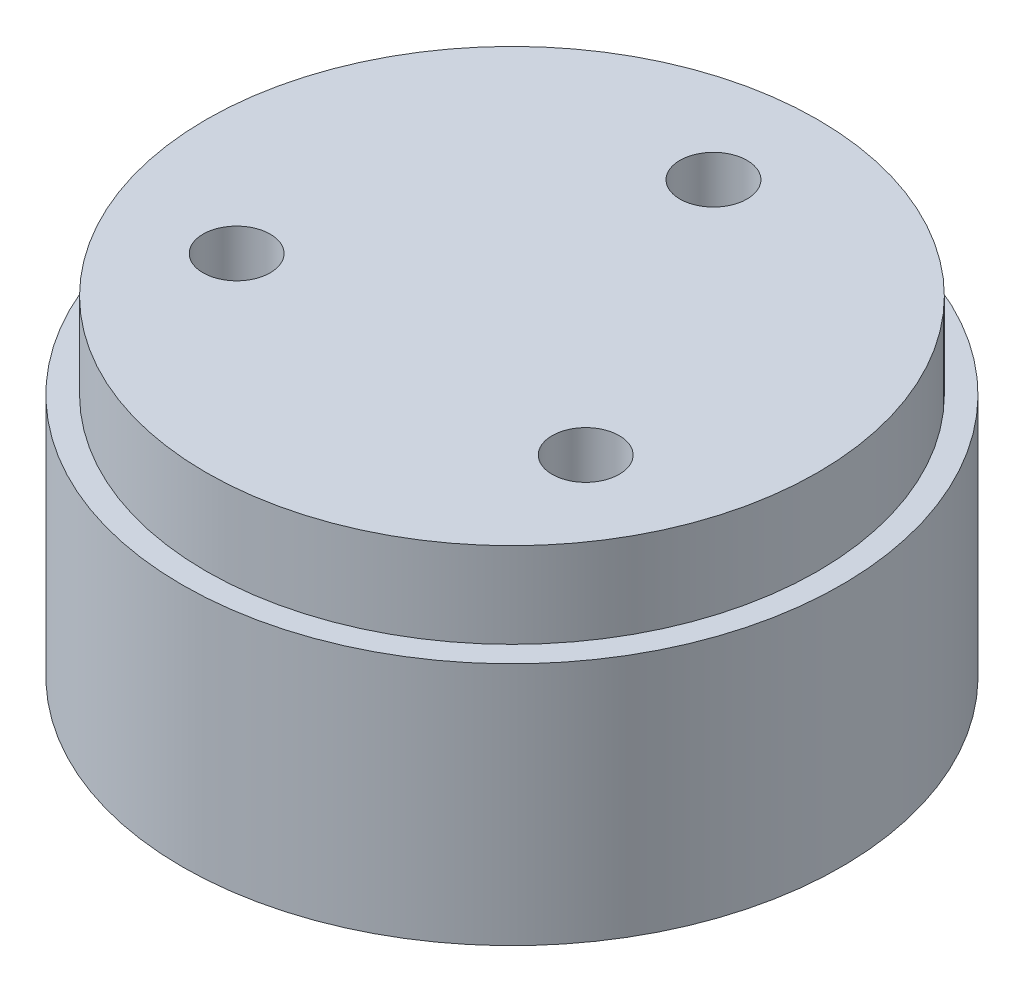
ISO-10303-21;
HEADER;
FILE_DESCRIPTION(('STEP AP214'),'2;1');
FILE_NAME('part.step','',(''),(''),'','','');
FILE_SCHEMA(('AUTOMOTIVE_DESIGN { 1 0 10303 214 1 1 1 1 }'));
ENDSEC;
DATA;
#1=APPLICATION_CONTEXT('core data for automotive mechanical design processes');
#2=APPLICATION_PROTOCOL_DEFINITION('international standard','automotive_design',2000,#1);
#3=PRODUCT_CONTEXT('',#1,'mechanical');
#4=PRODUCT('Part','Part','',(#3));
#5=PRODUCT_RELATED_PRODUCT_CATEGORY('part','',(#4));
#6=PRODUCT_DEFINITION_FORMATION('','',#4);
#7=PRODUCT_DEFINITION_CONTEXT('part definition',#1,'design');
#8=PRODUCT_DEFINITION('design','',#6,#7);
#9=PRODUCT_DEFINITION_SHAPE('','',#8);
#10=(LENGTH_UNIT() NAMED_UNIT(*) SI_UNIT(.MILLI.,.METRE.));
#11=(NAMED_UNIT(*) PLANE_ANGLE_UNIT() SI_UNIT($,.RADIAN.));
#12=(NAMED_UNIT(*) SI_UNIT($,.STERADIAN.) SOLID_ANGLE_UNIT());
#13=UNCERTAINTY_MEASURE_WITH_UNIT(LENGTH_MEASURE(1.E-05),#10,'distance_accuracy_value','');
#14=(GEOMETRIC_REPRESENTATION_CONTEXT(3) GLOBAL_UNCERTAINTY_ASSIGNED_CONTEXT((#13)) GLOBAL_UNIT_ASSIGNED_CONTEXT((#10,
#11,#12)) REPRESENTATION_CONTEXT('',''));
#15=CARTESIAN_POINT('',(0.,0.,0.));
#16=DIRECTION('',(0.,0.,1.));
#17=DIRECTION('',(1.,0.,0.));
#18=AXIS2_PLACEMENT_3D('',#15,#16,#17);
#19=CARTESIAN_POINT('',(0.,27.,0.));
#20=DIRECTION('',(0.,-1.,0.));
#21=DIRECTION('',(0.,0.,-1.));
#22=AXIS2_PLACEMENT_3D('',#19,#20,#21);
#23=CYLINDRICAL_SURFACE('',#22,27.);
#24=CARTESIAN_POINT('',(0.,0.,0.));
#25=DIRECTION('',(0.,1.,0.));
#26=DIRECTION('',(0.,0.,1.));
#27=AXIS2_PLACEMENT_3D('',#24,#25,#26);
#28=CIRCLE('',#27,27.);
#29=CARTESIAN_POINT('',(0.,0.,27.));
#30=VERTEX_POINT('',#29);
#31=EDGE_CURVE('E11',#30,#30,#28,.T.);
#32=ORIENTED_EDGE('',*,*,#31,.T.);
#33=EDGE_LOOP('',(#32));
#34=FACE_BOUND('',#33,.T.);
#35=CARTESIAN_POINT('',(0.,20.,0.));
#36=DIRECTION('',(0.,1.,0.));
#37=DIRECTION('',(0.,0.,1.));
#38=AXIS2_PLACEMENT_3D('',#35,#36,#37);
#39=CIRCLE('',#38,27.);
#40=CARTESIAN_POINT('',(0.,20.,27.));
#41=VERTEX_POINT('',#40);
#42=EDGE_CURVE('E70',#41,#41,#39,.F.);
#43=ORIENTED_EDGE('',*,*,#42,.T.);
#44=EDGE_LOOP('',(#43));
#45=FACE_BOUND('',#44,.T.);
#46=ADVANCED_FACE('F39',(#34,#45),#23,.T.);
#47=CARTESIAN_POINT('',(0.,27.,0.));
#48=DIRECTION('',(0.,1.,0.));
#49=DIRECTION('',(0.,0.,1.));
#50=AXIS2_PLACEMENT_3D('',#47,#48,#49);
#51=PLANE('',#50);
#52=CARTESIAN_POINT('',(14.2980794164811,27.,8.25499999999997));
#53=DIRECTION('',(0.,1.,0.));
#54=DIRECTION('',(0.,0.,1.));
#55=AXIS2_PLACEMENT_3D('',#52,#53,#54);
#56=CIRCLE('',#55,2.74999999999999);
#57=CARTESIAN_POINT('',(14.2980794164811,27.,11.005));
#58=VERTEX_POINT('',#57);
#59=EDGE_CURVE('E45',#58,#58,#56,.T.);
#60=ORIENTED_EDGE('',*,*,#59,.F.);
#61=EDGE_LOOP('',(#60));
#62=FACE_BOUND('',#61,.T.);
#63=CARTESIAN_POINT('',(0.,27.,-16.51));
#64=DIRECTION('',(0.,1.,0.));
#65=DIRECTION('',(0.,0.,1.));
#66=AXIS2_PLACEMENT_3D('',#63,#64,#65);
#67=CIRCLE('',#66,2.74999999999999);
#68=CARTESIAN_POINT('',(0.,27.,-13.76));
#69=VERTEX_POINT('',#68);
#70=EDGE_CURVE('E53',#69,#69,#67,.T.);
#71=ORIENTED_EDGE('',*,*,#70,.F.);
#72=EDGE_LOOP('',(#71));
#73=FACE_BOUND('',#72,.T.);
#74=CARTESIAN_POINT('',(-14.298079416481,27.,8.25500000000007));
#75=DIRECTION('',(0.,1.,0.));
#76=DIRECTION('',(0.,0.,1.));
#77=AXIS2_PLACEMENT_3D('',#74,#75,#76);
#78=CIRCLE('',#77,2.74999999999999);
#79=CARTESIAN_POINT('',(-14.298079416481,27.,11.0050000000001));
#80=VERTEX_POINT('',#79);
#81=EDGE_CURVE('E61',#80,#80,#78,.T.);
#82=ORIENTED_EDGE('',*,*,#81,.F.);
#83=EDGE_LOOP('',(#82));
#84=FACE_BOUND('',#83,.T.);
#85=CARTESIAN_POINT('',(0.,27.,0.));
#86=DIRECTION('',(0.,1.,0.));
#87=DIRECTION('',(0.,0.,1.));
#88=AXIS2_PLACEMENT_3D('',#85,#86,#87);
#89=CIRCLE('',#88,25.05);
#90=CARTESIAN_POINT('',(0.,27.,25.05));
#91=VERTEX_POINT('',#90);
#92=EDGE_CURVE('E71',#91,#91,#89,.T.);
#93=ORIENTED_EDGE('',*,*,#92,.T.);
#94=EDGE_LOOP('',(#93));
#95=FACE_BOUND('',#94,.T.);
#96=ADVANCED_FACE('F91',(#62,#73,#84,#95),#51,.T.);
#97=CARTESIAN_POINT('',(0.,0.,0.));
#98=DIRECTION('',(0.,1.,0.));
#99=DIRECTION('',(0.,0.,1.));
#100=AXIS2_PLACEMENT_3D('',#97,#98,#99);
#101=PLANE('',#100);
#102=CARTESIAN_POINT('',(0.,0.,-16.51));
#103=DIRECTION('',(0.,-1.,0.));
#104=DIRECTION('',(0.,0.,-1.));
#105=AXIS2_PLACEMENT_3D('',#102,#103,#104);
#106=CIRCLE('',#105,2.74999999999999);
#107=CARTESIAN_POINT('',(0.,0.,-19.26));
#108=VERTEX_POINT('',#107);
#109=EDGE_CURVE('E58',#108,#108,#106,.T.);
#110=ORIENTED_EDGE('',*,*,#109,.F.);
#111=EDGE_LOOP('',(#110));
#112=FACE_BOUND('',#111,.T.);
#113=CARTESIAN_POINT('',(14.2980794164811,0.,8.25499999999997));
#114=DIRECTION('',(0.,-1.,0.));
#115=DIRECTION('',(0.,0.,-1.));
#116=AXIS2_PLACEMENT_3D('',#113,#114,#115);
#117=CIRCLE('',#116,2.74999999999999);
#118=CARTESIAN_POINT('',(14.2980794164811,0.,5.50499999999998));
#119=VERTEX_POINT('',#118);
#120=EDGE_CURVE('E49',#119,#119,#117,.T.);
#121=ORIENTED_EDGE('',*,*,#120,.F.);
#122=EDGE_LOOP('',(#121));
#123=FACE_BOUND('',#122,.T.);
#124=ORIENTED_EDGE('',*,*,#31,.F.);
#125=EDGE_LOOP('',(#124));
#126=FACE_BOUND('',#125,.T.);
#127=CARTESIAN_POINT('',(-14.298079416481,0.,8.25500000000007));
#128=DIRECTION('',(0.,-1.,0.));
#129=DIRECTION('',(0.,0.,-1.));
#130=AXIS2_PLACEMENT_3D('',#127,#128,#129);
#131=CIRCLE('',#130,2.74999999999999);
#132=CARTESIAN_POINT('',(-14.298079416481,0.,5.50500000000008));
#133=VERTEX_POINT('',#132);
#134=EDGE_CURVE('E64',#133,#133,#131,.T.);
#135=ORIENTED_EDGE('',*,*,#134,.F.);
#136=EDGE_LOOP('',(#135));
#137=FACE_BOUND('',#136,.T.);
#138=ADVANCED_FACE('F93',(#112,#123,#126,#137),#101,.F.);
#139=CARTESIAN_POINT('',(14.2980794164811,0.,8.25499999999997));
#140=DIRECTION('',(0.,-1.,0.));
#141=DIRECTION('',(0.,0.,-1.));
#142=AXIS2_PLACEMENT_3D('',#139,#140,#141);
#143=CYLINDRICAL_SURFACE('',#142,2.74999999999999);
#144=ORIENTED_EDGE('',*,*,#120,.T.);
#145=EDGE_LOOP('',(#144));
#146=FACE_BOUND('',#145,.T.);
#147=ORIENTED_EDGE('',*,*,#59,.T.);
#148=EDGE_LOOP('',(#147));
#149=FACE_BOUND('',#148,.T.);
#150=ADVANCED_FACE('F100',(#146,#149),#143,.F.);
#151=CARTESIAN_POINT('',(0.,0.,-16.51));
#152=DIRECTION('',(0.,-1.,0.));
#153=DIRECTION('',(0.,0.,-1.));
#154=AXIS2_PLACEMENT_3D('',#151,#152,#153);
#155=CYLINDRICAL_SURFACE('',#154,2.74999999999999);
#156=ORIENTED_EDGE('',*,*,#109,.T.);
#157=EDGE_LOOP('',(#156));
#158=FACE_BOUND('',#157,.T.);
#159=ORIENTED_EDGE('',*,*,#70,.T.);
#160=EDGE_LOOP('',(#159));
#161=FACE_BOUND('',#160,.T.);
#162=ADVANCED_FACE('F106',(#158,#161),#155,.F.);
#163=CARTESIAN_POINT('',(-14.298079416481,0.,8.25500000000007));
#164=DIRECTION('',(0.,-1.,0.));
#165=DIRECTION('',(0.,0.,-1.));
#166=AXIS2_PLACEMENT_3D('',#163,#164,#165);
#167=CYLINDRICAL_SURFACE('',#166,2.74999999999999);
#168=ORIENTED_EDGE('',*,*,#134,.T.);
#169=EDGE_LOOP('',(#168));
#170=FACE_BOUND('',#169,.T.);
#171=ORIENTED_EDGE('',*,*,#81,.T.);
#172=EDGE_LOOP('',(#171));
#173=FACE_BOUND('',#172,.T.);
#174=ADVANCED_FACE('F87',(#170,#173),#167,.F.);
#175=CARTESIAN_POINT('',(0.,-76.3675323681471,0.));
#176=DIRECTION('',(0.,1.,0.));
#177=DIRECTION('',(0.,0.,1.));
#178=AXIS2_PLACEMENT_3D('',#175,#176,#177);
#179=CYLINDRICAL_SURFACE('',#178,25.05);
#180=CARTESIAN_POINT('',(0.,20.,0.));
#181=DIRECTION('',(0.,1.,0.));
#182=DIRECTION('',(0.,0.,1.));
#183=AXIS2_PLACEMENT_3D('',#180,#181,#182);
#184=CIRCLE('',#183,25.05);
#185=CARTESIAN_POINT('',(0.,20.,25.05));
#186=VERTEX_POINT('',#185);
#187=EDGE_CURVE('E67',#186,#186,#184,.F.);
#188=ORIENTED_EDGE('',*,*,#187,.F.);
#189=EDGE_LOOP('',(#188));
#190=FACE_BOUND('',#189,.T.);
#191=ORIENTED_EDGE('',*,*,#92,.F.);
#192=EDGE_LOOP('',(#191));
#193=FACE_BOUND('',#192,.T.);
#194=ADVANCED_FACE('F81',(#190,#193),#179,.T.);
#195=CARTESIAN_POINT('',(0.,20.,0.));
#196=DIRECTION('',(0.,1.,0.));
#197=DIRECTION('',(0.,0.,1.));
#198=AXIS2_PLACEMENT_3D('',#195,#196,#197);
#199=PLANE('',#198);
#200=ORIENTED_EDGE('',*,*,#42,.F.);
#201=EDGE_LOOP('',(#200));
#202=FACE_BOUND('',#201,.T.);
#203=ORIENTED_EDGE('',*,*,#187,.T.);
#204=EDGE_LOOP('',(#203));
#205=FACE_BOUND('',#204,.T.);
#206=ADVANCED_FACE('F78',(#202,#205),#199,.T.);
#207=CLOSED_SHELL('',(#46,#96,#138,#150,#162,#174,#194,#206));
#208=MANIFOLD_SOLID_BREP('B2',#207);
#209=ADVANCED_BREP_SHAPE_REPRESENTATION('',(#18,#208),#14);
#210=SHAPE_DEFINITION_REPRESENTATION(#9,#209);
ENDSEC;
END-ISO-10303-21;
